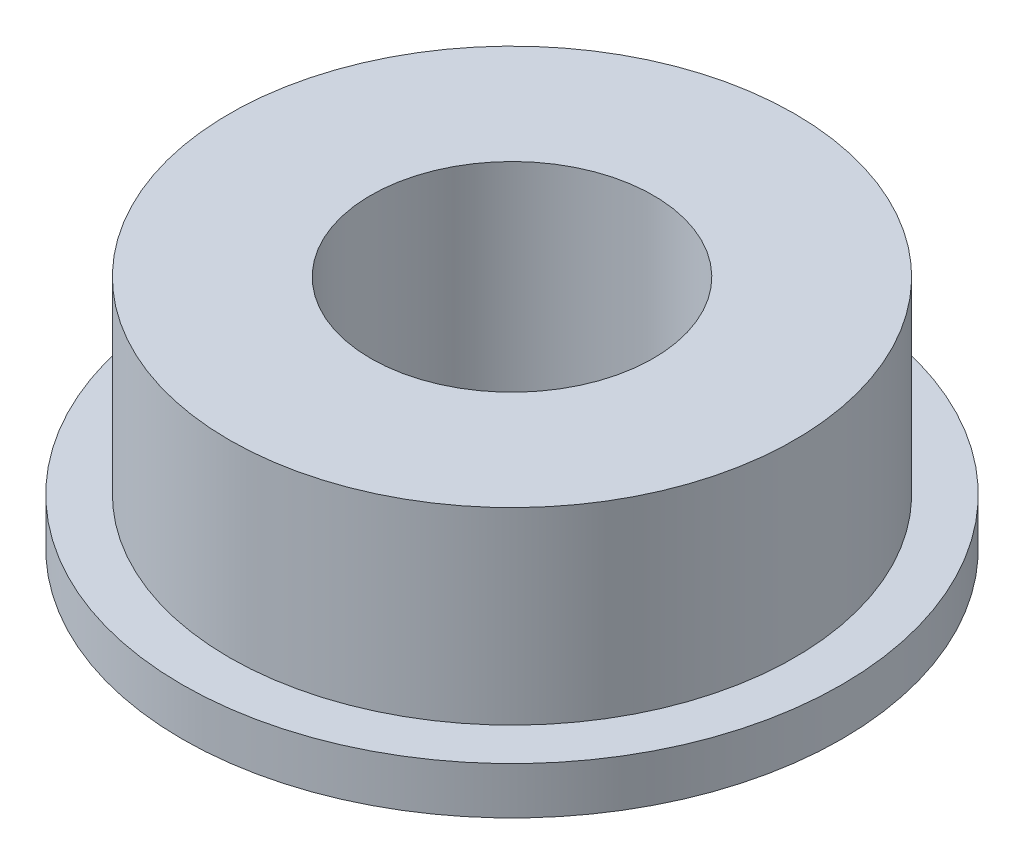
ISO-10303-21;
HEADER;
FILE_DESCRIPTION(('STEP AP214'),'2;1');
FILE_NAME('part.step','',(''),(''),'','','');
FILE_SCHEMA(('AUTOMOTIVE_DESIGN { 1 0 10303 214 1 1 1 1 }'));
ENDSEC;
DATA;
#1=APPLICATION_CONTEXT('core data for automotive mechanical design processes');
#2=APPLICATION_PROTOCOL_DEFINITION('international standard','automotive_design',2000,#1);
#3=PRODUCT_CONTEXT('',#1,'mechanical');
#4=PRODUCT('Part','Part','',(#3));
#5=PRODUCT_RELATED_PRODUCT_CATEGORY('part','',(#4));
#6=PRODUCT_DEFINITION_FORMATION('','',#4);
#7=PRODUCT_DEFINITION_CONTEXT('part definition',#1,'design');
#8=PRODUCT_DEFINITION('design','',#6,#7);
#9=PRODUCT_DEFINITION_SHAPE('','',#8);
#10=(LENGTH_UNIT() NAMED_UNIT(*) SI_UNIT(.MILLI.,.METRE.));
#11=(NAMED_UNIT(*) PLANE_ANGLE_UNIT() SI_UNIT($,.RADIAN.));
#12=(NAMED_UNIT(*) SI_UNIT($,.STERADIAN.) SOLID_ANGLE_UNIT());
#13=UNCERTAINTY_MEASURE_WITH_UNIT(LENGTH_MEASURE(1.E-05),#10,'distance_accuracy_value','');
#14=(GEOMETRIC_REPRESENTATION_CONTEXT(3) GLOBAL_UNCERTAINTY_ASSIGNED_CONTEXT((#13)) GLOBAL_UNIT_ASSIGNED_CONTEXT((#10,
#11,#12)) REPRESENTATION_CONTEXT('',''));
#15=CARTESIAN_POINT('',(0.,0.,0.));
#16=DIRECTION('',(0.,0.,1.));
#17=DIRECTION('',(1.,0.,0.));
#18=AXIS2_PLACEMENT_3D('',#15,#16,#17);
#19=CARTESIAN_POINT('',(0.,9.58557308201758,0.));
#20=DIRECTION('',(0.,1.,0.));
#21=DIRECTION('',(0.,0.,1.));
#22=AXIS2_PLACEMENT_3D('',#19,#20,#21);
#23=CYLINDRICAL_SURFACE('',#22,3.);
#24=CARTESIAN_POINT('',(0.,2.5,0.));
#25=DIRECTION('',(0.,1.,0.));
#26=DIRECTION('',(0.,0.,1.));
#27=AXIS2_PLACEMENT_3D('',#24,#25,#26);
#28=CIRCLE('',#27,3.);
#29=CARTESIAN_POINT('',(0.,2.5,3.));
#30=VERTEX_POINT('',#29);
#31=EDGE_CURVE('E33',#30,#30,#28,.F.);
#32=ORIENTED_EDGE('',*,*,#31,.T.);
#33=EDGE_LOOP('',(#32));
#34=FACE_BOUND('',#33,.T.);
#35=CARTESIAN_POINT('',(0.,0.5,0.));
#36=DIRECTION('',(0.,1.,0.));
#37=DIRECTION('',(0.,0.,1.));
#38=AXIS2_PLACEMENT_3D('',#35,#36,#37);
#39=CIRCLE('',#38,3.);
#40=CARTESIAN_POINT('',(0.,0.5,3.));
#41=VERTEX_POINT('',#40);
#42=EDGE_CURVE('E17',#41,#41,#39,.T.);
#43=ORIENTED_EDGE('',*,*,#42,.T.);
#44=EDGE_LOOP('',(#43));
#45=FACE_BOUND('',#44,.T.);
#46=ADVANCED_FACE('F14',(#34,#45),#23,.T.);
#47=CARTESIAN_POINT('',(0.,0.5,-3.));
#48=DIRECTION('',(0.,-1.,0.));
#49=DIRECTION('',(0.,0.,-1.));
#50=AXIS2_PLACEMENT_3D('',#47,#48,#49);
#51=PLANE('',#50);
#52=CARTESIAN_POINT('',(0.,0.5,0.));
#53=DIRECTION('',(0.,1.,0.));
#54=DIRECTION('',(0.,0.,1.));
#55=AXIS2_PLACEMENT_3D('',#52,#53,#54);
#56=CIRCLE('',#55,3.5);
#57=CARTESIAN_POINT('',(0.,0.5,3.5));
#58=VERTEX_POINT('',#57);
#59=EDGE_CURVE('E31',#58,#58,#56,.F.);
#60=ORIENTED_EDGE('',*,*,#59,.F.);
#61=EDGE_LOOP('',(#60));
#62=FACE_BOUND('',#61,.T.);
#63=ORIENTED_EDGE('',*,*,#42,.F.);
#64=EDGE_LOOP('',(#63));
#65=FACE_BOUND('',#64,.T.);
#66=ADVANCED_FACE('F41',(#62,#65),#51,.F.);
#67=CARTESIAN_POINT('',(0.,2.5,-1.5));
#68=DIRECTION('',(0.,-1.,0.));
#69=DIRECTION('',(0.,0.,-1.));
#70=AXIS2_PLACEMENT_3D('',#67,#68,#69);
#71=PLANE('',#70);
#72=ORIENTED_EDGE('',*,*,#31,.F.);
#73=EDGE_LOOP('',(#72));
#74=FACE_BOUND('',#73,.T.);
#75=CARTESIAN_POINT('',(0.,2.5,0.));
#76=DIRECTION('',(0.,1.,0.));
#77=DIRECTION('',(0.,0.,1.));
#78=AXIS2_PLACEMENT_3D('',#75,#76,#77);
#79=CIRCLE('',#78,1.5);
#80=CARTESIAN_POINT('',(0.,2.5,1.5));
#81=VERTEX_POINT('',#80);
#82=EDGE_CURVE('E26',#81,#81,#79,.F.);
#83=ORIENTED_EDGE('',*,*,#82,.T.);
#84=EDGE_LOOP('',(#83));
#85=FACE_BOUND('',#84,.T.);
#86=ADVANCED_FACE('F43',(#74,#85),#71,.F.);
#87=CARTESIAN_POINT('',(0.,9.58557308201758,0.));
#88=DIRECTION('',(0.,1.,0.));
#89=DIRECTION('',(0.,0.,1.));
#90=AXIS2_PLACEMENT_3D('',#87,#88,#89);
#91=CYLINDRICAL_SURFACE('',#90,3.5);
#92=ORIENTED_EDGE('',*,*,#59,.T.);
#93=EDGE_LOOP('',(#92));
#94=FACE_BOUND('',#93,.T.);
#95=CARTESIAN_POINT('',(0.,0.,0.));
#96=DIRECTION('',(0.,1.,0.));
#97=DIRECTION('',(0.,0.,1.));
#98=AXIS2_PLACEMENT_3D('',#95,#96,#97);
#99=CIRCLE('',#98,3.5);
#100=CARTESIAN_POINT('',(0.,0.,3.5));
#101=VERTEX_POINT('',#100);
#102=EDGE_CURVE('E21',#101,#101,#99,.T.);
#103=ORIENTED_EDGE('',*,*,#102,.T.);
#104=EDGE_LOOP('',(#103));
#105=FACE_BOUND('',#104,.T.);
#106=ADVANCED_FACE('F50',(#94,#105),#91,.T.);
#107=CARTESIAN_POINT('',(0.,9.58557308201758,0.));
#108=DIRECTION('',(0.,1.,0.));
#109=DIRECTION('',(0.,0.,1.));
#110=AXIS2_PLACEMENT_3D('',#107,#108,#109);
#111=CYLINDRICAL_SURFACE('',#110,1.5);
#112=CARTESIAN_POINT('',(0.,0.,0.));
#113=DIRECTION('',(0.,1.,0.));
#114=DIRECTION('',(0.,0.,1.));
#115=AXIS2_PLACEMENT_3D('',#112,#113,#114);
#116=CIRCLE('',#115,1.5);
#117=CARTESIAN_POINT('',(0.,0.,1.5));
#118=VERTEX_POINT('',#117);
#119=EDGE_CURVE('E10',#118,#118,#116,.F.);
#120=ORIENTED_EDGE('',*,*,#119,.T.);
#121=EDGE_LOOP('',(#120));
#122=FACE_BOUND('',#121,.T.);
#123=ORIENTED_EDGE('',*,*,#82,.F.);
#124=EDGE_LOOP('',(#123));
#125=FACE_BOUND('',#124,.T.);
#126=ADVANCED_FACE('F56',(#122,#125),#111,.F.);
#127=CARTESIAN_POINT('',(0.,0.,-3.5));
#128=DIRECTION('',(0.,1.,0.));
#129=DIRECTION('',(0.,0.,1.));
#130=AXIS2_PLACEMENT_3D('',#127,#128,#129);
#131=PLANE('',#130);
#132=ORIENTED_EDGE('',*,*,#119,.F.);
#133=EDGE_LOOP('',(#132));
#134=FACE_BOUND('',#133,.T.);
#135=ORIENTED_EDGE('',*,*,#102,.F.);
#136=EDGE_LOOP('',(#135));
#137=FACE_BOUND('',#136,.T.);
#138=ADVANCED_FACE('F54',(#134,#137),#131,.F.);
#139=CLOSED_SHELL('',(#46,#66,#86,#106,#126,#138));
#140=MANIFOLD_SOLID_BREP('B1',#139);
#141=ADVANCED_BREP_SHAPE_REPRESENTATION('',(#18,#140),#14);
#142=SHAPE_DEFINITION_REPRESENTATION(#9,#141);
ENDSEC;
END-ISO-10303-21;
